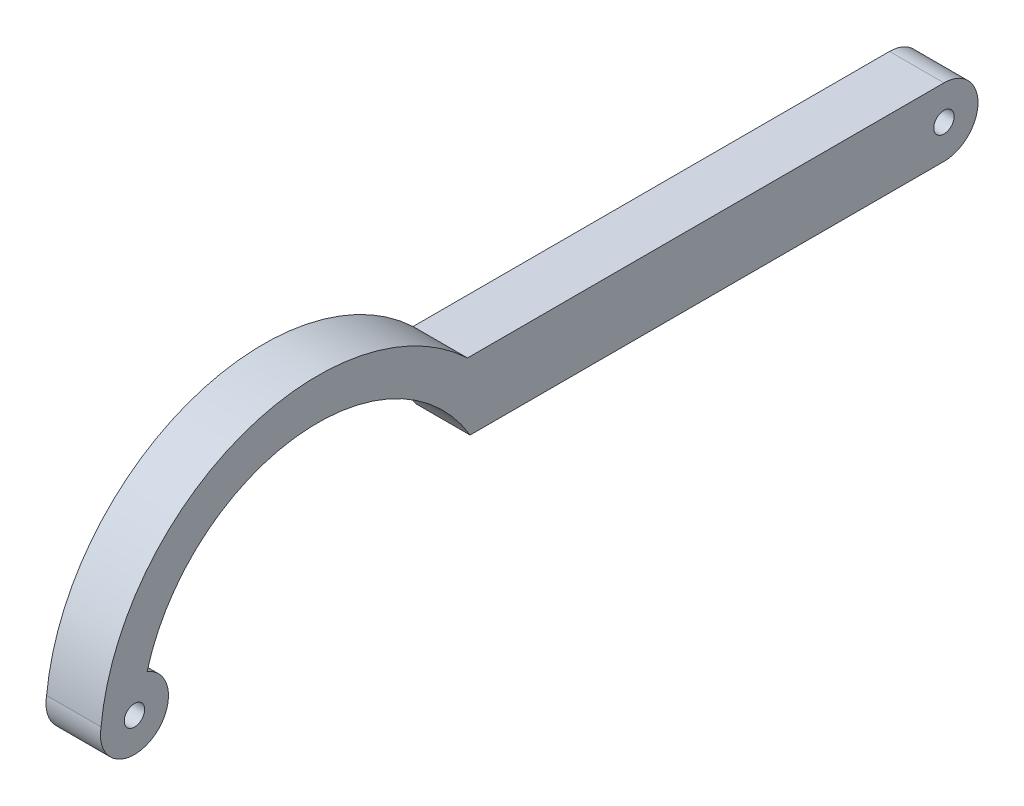
ISO-10303-21;
HEADER;
FILE_DESCRIPTION(('STEP AP214'),'2;1');
FILE_NAME('part.step','',(''),(''),'','','');
FILE_SCHEMA(('AUTOMOTIVE_DESIGN { 1 0 10303 214 1 1 1 1 }'));
ENDSEC;
DATA;
#1=APPLICATION_CONTEXT('core data for automotive mechanical design processes');
#2=APPLICATION_PROTOCOL_DEFINITION('international standard','automotive_design',2000,#1);
#3=PRODUCT_CONTEXT('',#1,'mechanical');
#4=PRODUCT('Part','Part','',(#3));
#5=PRODUCT_RELATED_PRODUCT_CATEGORY('part','',(#4));
#6=PRODUCT_DEFINITION_FORMATION('','',#4);
#7=PRODUCT_DEFINITION_CONTEXT('part definition',#1,'design');
#8=PRODUCT_DEFINITION('design','',#6,#7);
#9=PRODUCT_DEFINITION_SHAPE('','',#8);
#10=(LENGTH_UNIT() NAMED_UNIT(*) SI_UNIT(.MILLI.,.METRE.));
#11=(NAMED_UNIT(*) PLANE_ANGLE_UNIT() SI_UNIT($,.RADIAN.));
#12=(NAMED_UNIT(*) SI_UNIT($,.STERADIAN.) SOLID_ANGLE_UNIT());
#13=UNCERTAINTY_MEASURE_WITH_UNIT(LENGTH_MEASURE(1.E-05),#10,'distance_accuracy_value','');
#14=(GEOMETRIC_REPRESENTATION_CONTEXT(3) GLOBAL_UNCERTAINTY_ASSIGNED_CONTEXT((#13)) GLOBAL_UNIT_ASSIGNED_CONTEXT((#10,
#11,#12)) REPRESENTATION_CONTEXT('',''));
#15=CARTESIAN_POINT('',(0.,0.,0.));
#16=DIRECTION('',(0.,0.,1.));
#17=DIRECTION('',(1.,0.,0.));
#18=AXIS2_PLACEMENT_3D('',#15,#16,#17);
#19=CARTESIAN_POINT('',(4.,-1.12098448473489,-13.4664243080931));
#20=DIRECTION('',(1.,0.,0.));
#21=DIRECTION('',(0.,0.,-1.));
#22=AXIS2_PLACEMENT_3D('',#19,#20,#21);
#23=PLANE('',#22);
#24=CARTESIAN_POINT('',(4.,8.,-59.464274989274));
#25=DIRECTION('',(1.,0.,0.));
#26=DIRECTION('',(0.,0.,-1.));
#27=AXIS2_PLACEMENT_3D('',#24,#25,#26);
#28=CIRCLE('',#27,0.749999999999999);
#29=CARTESIAN_POINT('',(4.,8.,-60.214274989274));
#30=VERTEX_POINT('',#29);
#31=EDGE_CURVE('E144',#30,#30,#28,.T.);
#32=ORIENTED_EDGE('',*,*,#31,.F.);
#33=EDGE_LOOP('',(#32));
#34=FACE_BOUND('',#33,.T.);
#35=CARTESIAN_POINT('',(4.,-1.12098448473489,-13.4664243080931));
#36=DIRECTION('',(1.,0.,0.));
#37=DIRECTION('',(0.,0.,-1.));
#38=AXIS2_PLACEMENT_3D('',#35,#36,#37);
#39=CIRCLE('',#38,16.);
#40=CARTESIAN_POINT('',(4.,10.5,-24.464274989274));
#41=VERTEX_POINT('',#40);
#42=CARTESIAN_POINT('',(4.,0.482216385258856,2.45305266103031));
#43=VERTEX_POINT('',#42);
#44=EDGE_CURVE('E156',#41,#43,#39,.T.);
#45=ORIENTED_EDGE('',*,*,#44,.T.);
#46=CARTESIAN_POINT('',(4.,0.,0.));
#47=DIRECTION('',(1.,0.,0.));
#48=DIRECTION('',(0.,0.,-1.));
#49=AXIS2_PLACEMENT_3D('',#46,#47,#48);
#50=CIRCLE('',#49,2.5);
#51=CARTESIAN_POINT('',(4.,2.32049090490723,-0.930226832682662));
#52=VERTEX_POINT('',#51);
#53=EDGE_CURVE('E104',#43,#52,#50,.T.);
#54=ORIENTED_EDGE('',*,*,#53,.T.);
#55=CARTESIAN_POINT('',(4.,-1.12098448473489,-13.4664243080931));
#56=DIRECTION('',(-1.,0.,0.));
#57=DIRECTION('',(0.,0.,1.));
#58=AXIS2_PLACEMENT_3D('',#55,#56,#57);
#59=CIRCLE('',#58,13.);
#60=CARTESIAN_POINT('',(4.,5.49999999999999,-24.6540319367553));
#61=VERTEX_POINT('',#60);
#62=EDGE_CURVE('E117',#52,#61,#59,.T.);
#63=ORIENTED_EDGE('',*,*,#62,.T.);
#64=DIRECTION('',(0.,0.,-1.));
#65=VECTOR('',#64,1.);
#66=CARTESIAN_POINT('',(4.,5.5,-59.464274989274));
#67=LINE('',#66,#65);
#68=CARTESIAN_POINT('',(4.,5.5,-59.464274989274));
#69=VERTEX_POINT('',#68);
#70=EDGE_CURVE('E111',#61,#69,#67,.T.);
#71=ORIENTED_EDGE('',*,*,#70,.T.);
#72=CARTESIAN_POINT('',(4.,8.,-59.464274989274));
#73=DIRECTION('',(1.,0.,0.));
#74=DIRECTION('',(0.,0.,-1.));
#75=AXIS2_PLACEMENT_3D('',#72,#73,#74);
#76=CIRCLE('',#75,2.5);
#77=CARTESIAN_POINT('',(4.,10.5,-59.464274989274));
#78=VERTEX_POINT('',#77);
#79=EDGE_CURVE('E115',#69,#78,#76,.T.);
#80=ORIENTED_EDGE('',*,*,#79,.T.);
#81=DIRECTION('',(0.,0.,1.));
#82=VECTOR('',#81,1.);
#83=CARTESIAN_POINT('',(4.,10.5,-59.464274989274));
#84=LINE('',#83,#82);
#85=EDGE_CURVE('E67',#78,#41,#84,.T.);
#86=ORIENTED_EDGE('',*,*,#85,.T.);
#87=EDGE_LOOP('',(#45,#54,#63,#71,#80,#86));
#88=FACE_BOUND('',#87,.T.);
#89=CARTESIAN_POINT('',(4.,0.,0.));
#90=DIRECTION('',(1.,0.,0.));
#91=DIRECTION('',(0.,0.,-1.));
#92=AXIS2_PLACEMENT_3D('',#89,#90,#91);
#93=CIRCLE('',#92,0.75);
#94=CARTESIAN_POINT('',(4.,0.,-0.75));
#95=VERTEX_POINT('',#94);
#96=EDGE_CURVE('E202',#95,#95,#93,.T.);
#97=ORIENTED_EDGE('',*,*,#96,.F.);
#98=EDGE_LOOP('',(#97));
#99=FACE_BOUND('',#98,.T.);
#100=ADVANCED_FACE('F49',(#34,#88,#99),#23,.T.);
#101=CARTESIAN_POINT('',(0.,-1.12098448473489,-13.4664243080931));
#102=DIRECTION('',(1.,0.,0.));
#103=DIRECTION('',(0.,0.,-1.));
#104=AXIS2_PLACEMENT_3D('',#101,#102,#103);
#105=PLANE('',#104);
#106=CARTESIAN_POINT('',(0.,-1.12098448473489,-13.4664243080931));
#107=DIRECTION('',(1.,0.,0.));
#108=DIRECTION('',(0.,0.,-1.));
#109=AXIS2_PLACEMENT_3D('',#106,#107,#108);
#110=CIRCLE('',#109,16.);
#111=CARTESIAN_POINT('',(0.,10.5,-24.464274989274));
#112=VERTEX_POINT('',#111);
#113=CARTESIAN_POINT('',(0.,0.482216385258856,2.45305266103031));
#114=VERTEX_POINT('',#113);
#115=EDGE_CURVE('E139',#112,#114,#110,.T.);
#116=ORIENTED_EDGE('',*,*,#115,.F.);
#117=DIRECTION('',(0.,0.,1.));
#118=VECTOR('',#117,1.);
#119=CARTESIAN_POINT('',(0.,10.5,-59.464274989274));
#120=LINE('',#119,#118);
#121=CARTESIAN_POINT('',(0.,10.5,-59.464274989274));
#122=VERTEX_POINT('',#121);
#123=EDGE_CURVE('E96',#122,#112,#120,.T.);
#124=ORIENTED_EDGE('',*,*,#123,.F.);
#125=CARTESIAN_POINT('',(0.,8.,-59.464274989274));
#126=DIRECTION('',(1.,0.,0.));
#127=DIRECTION('',(0.,0.,-1.));
#128=AXIS2_PLACEMENT_3D('',#125,#126,#127);
#129=CIRCLE('',#128,2.5);
#130=CARTESIAN_POINT('',(0.,5.5,-59.464274989274));
#131=VERTEX_POINT('',#130);
#132=EDGE_CURVE('E90',#131,#122,#129,.T.);
#133=ORIENTED_EDGE('',*,*,#132,.F.);
#134=DIRECTION('',(0.,0.,-1.));
#135=VECTOR('',#134,1.);
#136=CARTESIAN_POINT('',(0.,5.5,-59.464274989274));
#137=LINE('',#136,#135);
#138=CARTESIAN_POINT('',(0.,5.49999999999999,-24.6540319367553));
#139=VERTEX_POINT('',#138);
#140=EDGE_CURVE('E126',#139,#131,#137,.T.);
#141=ORIENTED_EDGE('',*,*,#140,.F.);
#142=CARTESIAN_POINT('',(0.,-1.12098448473489,-13.4664243080931));
#143=DIRECTION('',(-1.,0.,0.));
#144=DIRECTION('',(0.,0.,1.));
#145=AXIS2_PLACEMENT_3D('',#142,#143,#144);
#146=CIRCLE('',#145,13.);
#147=CARTESIAN_POINT('',(0.,2.32049090490723,-0.930226832682662));
#148=VERTEX_POINT('',#147);
#149=EDGE_CURVE('E147',#148,#139,#146,.T.);
#150=ORIENTED_EDGE('',*,*,#149,.F.);
#151=CARTESIAN_POINT('',(0.,0.,0.));
#152=DIRECTION('',(1.,0.,0.));
#153=DIRECTION('',(0.,0.,-1.));
#154=AXIS2_PLACEMENT_3D('',#151,#152,#153);
#155=CIRCLE('',#154,2.5);
#156=EDGE_CURVE('E143',#114,#148,#155,.T.);
#157=ORIENTED_EDGE('',*,*,#156,.F.);
#158=EDGE_LOOP('',(#116,#124,#133,#141,#150,#157));
#159=FACE_BOUND('',#158,.T.);
#160=CARTESIAN_POINT('',(0.,8.,-59.464274989274));
#161=DIRECTION('',(1.,0.,0.));
#162=DIRECTION('',(0.,0.,-1.));
#163=AXIS2_PLACEMENT_3D('',#160,#161,#162);
#164=CIRCLE('',#163,0.749999999999999);
#165=CARTESIAN_POINT('',(0.,8.,-60.214274989274));
#166=VERTEX_POINT('',#165);
#167=EDGE_CURVE('E210',#166,#166,#164,.T.);
#168=ORIENTED_EDGE('',*,*,#167,.T.);
#169=EDGE_LOOP('',(#168));
#170=FACE_BOUND('',#169,.T.);
#171=CARTESIAN_POINT('',(0.,0.,0.));
#172=DIRECTION('',(1.,0.,0.));
#173=DIRECTION('',(0.,0.,-1.));
#174=AXIS2_PLACEMENT_3D('',#171,#172,#173);
#175=CIRCLE('',#174,0.75);
#176=CARTESIAN_POINT('',(0.,0.,-0.75));
#177=VERTEX_POINT('',#176);
#178=EDGE_CURVE('E205',#177,#177,#175,.T.);
#179=ORIENTED_EDGE('',*,*,#178,.T.);
#180=EDGE_LOOP('',(#179));
#181=FACE_BOUND('',#180,.T.);
#182=ADVANCED_FACE('F169',(#159,#170,#181),#105,.F.);
#183=CARTESIAN_POINT('',(4.,-1.12098448473489,-13.4664243080931));
#184=DIRECTION('',(-1.,0.,0.));
#185=DIRECTION('',(0.,0.,1.));
#186=AXIS2_PLACEMENT_3D('',#183,#184,#185);
#187=CYLINDRICAL_SURFACE('',#186,16.);
#188=ORIENTED_EDGE('',*,*,#115,.T.);
#189=DIRECTION('',(-1.,0.,0.));
#190=VECTOR('',#189,1.);
#191=CARTESIAN_POINT('',(4.,0.482216385258856,2.45305266103031));
#192=LINE('',#191,#190);
#193=EDGE_CURVE('E11',#43,#114,#192,.T.);
#194=ORIENTED_EDGE('',*,*,#193,.F.);
#195=ORIENTED_EDGE('',*,*,#44,.F.);
#196=DIRECTION('',(-1.,0.,0.));
#197=VECTOR('',#196,1.);
#198=CARTESIAN_POINT('',(4.,10.5,-24.464274989274));
#199=LINE('',#198,#197);
#200=EDGE_CURVE('E135',#41,#112,#199,.T.);
#201=ORIENTED_EDGE('',*,*,#200,.T.);
#202=EDGE_LOOP('',(#188,#194,#195,#201));
#203=FACE_BOUND('',#202,.T.);
#204=ADVANCED_FACE('F51',(#203),#187,.T.);
#205=CARTESIAN_POINT('',(4.,0.,0.));
#206=DIRECTION('',(-1.,0.,0.));
#207=DIRECTION('',(0.,0.,1.));
#208=AXIS2_PLACEMENT_3D('',#205,#206,#207);
#209=CYLINDRICAL_SURFACE('',#208,2.5);
#210=ORIENTED_EDGE('',*,*,#156,.T.);
#211=DIRECTION('',(-1.,0.,0.));
#212=VECTOR('',#211,1.);
#213=CARTESIAN_POINT('',(4.,2.32049090490723,-0.930226832682662));
#214=LINE('',#213,#212);
#215=EDGE_CURVE('E59',#52,#148,#214,.T.);
#216=ORIENTED_EDGE('',*,*,#215,.F.);
#217=ORIENTED_EDGE('',*,*,#53,.F.);
#218=ORIENTED_EDGE('',*,*,#193,.T.);
#219=EDGE_LOOP('',(#210,#216,#217,#218));
#220=FACE_BOUND('',#219,.T.);
#221=ADVANCED_FACE('F256',(#220),#209,.T.);
#222=CARTESIAN_POINT('',(4.,-1.12098448473489,-13.4664243080931));
#223=DIRECTION('',(-1.,0.,0.));
#224=DIRECTION('',(0.,0.,1.));
#225=AXIS2_PLACEMENT_3D('',#222,#223,#224);
#226=CYLINDRICAL_SURFACE('',#225,13.);
#227=ORIENTED_EDGE('',*,*,#149,.T.);
#228=DIRECTION('',(-1.,0.,0.));
#229=VECTOR('',#228,1.);
#230=CARTESIAN_POINT('',(4.,5.49999999999999,-24.6540319367553));
#231=LINE('',#230,#229);
#232=EDGE_CURVE('E128',#61,#139,#231,.T.);
#233=ORIENTED_EDGE('',*,*,#232,.F.);
#234=ORIENTED_EDGE('',*,*,#62,.F.);
#235=ORIENTED_EDGE('',*,*,#215,.T.);
#236=EDGE_LOOP('',(#227,#233,#234,#235));
#237=FACE_BOUND('',#236,.T.);
#238=ADVANCED_FACE('F166',(#237),#226,.F.);
#239=CARTESIAN_POINT('',(4.,5.5,-59.464274989274));
#240=DIRECTION('',(0.,1.,0.));
#241=DIRECTION('',(0.,0.,1.));
#242=AXIS2_PLACEMENT_3D('',#239,#240,#241);
#243=PLANE('',#242);
#244=ORIENTED_EDGE('',*,*,#140,.T.);
#245=DIRECTION('',(-1.,0.,0.));
#246=VECTOR('',#245,1.);
#247=CARTESIAN_POINT('',(4.,5.5,-59.464274989274));
#248=LINE('',#247,#246);
#249=EDGE_CURVE('E123',#69,#131,#248,.T.);
#250=ORIENTED_EDGE('',*,*,#249,.F.);
#251=ORIENTED_EDGE('',*,*,#70,.F.);
#252=ORIENTED_EDGE('',*,*,#232,.T.);
#253=EDGE_LOOP('',(#244,#250,#251,#252));
#254=FACE_BOUND('',#253,.T.);
#255=ADVANCED_FACE('F124',(#254),#243,.F.);
#256=CARTESIAN_POINT('',(4.,8.,-59.464274989274));
#257=DIRECTION('',(-1.,0.,0.));
#258=DIRECTION('',(0.,0.,1.));
#259=AXIS2_PLACEMENT_3D('',#256,#257,#258);
#260=CYLINDRICAL_SURFACE('',#259,2.5);
#261=ORIENTED_EDGE('',*,*,#132,.T.);
#262=DIRECTION('',(-1.,0.,0.));
#263=VECTOR('',#262,1.);
#264=CARTESIAN_POINT('',(4.,10.5,-59.464274989274));
#265=LINE('',#264,#263);
#266=EDGE_CURVE('E129',#78,#122,#265,.T.);
#267=ORIENTED_EDGE('',*,*,#266,.F.);
#268=ORIENTED_EDGE('',*,*,#79,.F.);
#269=ORIENTED_EDGE('',*,*,#249,.T.);
#270=EDGE_LOOP('',(#261,#267,#268,#269));
#271=FACE_BOUND('',#270,.T.);
#272=ADVANCED_FACE('F131',(#271),#260,.T.);
#273=CARTESIAN_POINT('',(4.,10.5,-59.464274989274));
#274=DIRECTION('',(0.,-1.,0.));
#275=DIRECTION('',(0.,0.,-1.));
#276=AXIS2_PLACEMENT_3D('',#273,#274,#275);
#277=PLANE('',#276);
#278=ORIENTED_EDGE('',*,*,#123,.T.);
#279=ORIENTED_EDGE('',*,*,#200,.F.);
#280=ORIENTED_EDGE('',*,*,#85,.F.);
#281=ORIENTED_EDGE('',*,*,#266,.T.);
#282=EDGE_LOOP('',(#278,#279,#280,#281));
#283=FACE_BOUND('',#282,.T.);
#284=ADVANCED_FACE('F174',(#283),#277,.F.);
#285=CARTESIAN_POINT('',(4.,8.,-59.464274989274));
#286=DIRECTION('',(-1.,0.,0.));
#287=DIRECTION('',(0.,0.,1.));
#288=AXIS2_PLACEMENT_3D('',#285,#286,#287);
#289=CYLINDRICAL_SURFACE('',#288,0.749999999999999);
#290=ORIENTED_EDGE('',*,*,#31,.T.);
#291=EDGE_LOOP('',(#290));
#292=FACE_BOUND('',#291,.T.);
#293=ORIENTED_EDGE('',*,*,#167,.F.);
#294=EDGE_LOOP('',(#293));
#295=FACE_BOUND('',#294,.T.);
#296=ADVANCED_FACE('F176',(#292,#295),#289,.F.);
#297=CARTESIAN_POINT('',(4.,0.,0.));
#298=DIRECTION('',(-1.,0.,0.));
#299=DIRECTION('',(0.,0.,1.));
#300=AXIS2_PLACEMENT_3D('',#297,#298,#299);
#301=CYLINDRICAL_SURFACE('',#300,0.75);
#302=ORIENTED_EDGE('',*,*,#96,.T.);
#303=EDGE_LOOP('',(#302));
#304=FACE_BOUND('',#303,.T.);
#305=ORIENTED_EDGE('',*,*,#178,.F.);
#306=EDGE_LOOP('',(#305));
#307=FACE_BOUND('',#306,.T.);
#308=ADVANCED_FACE('F182',(#304,#307),#301,.F.);
#309=CLOSED_SHELL('',(#100,#182,#204,#221,#238,#255,#272,#284,#296,#308));
#310=MANIFOLD_SOLID_BREP('B2',#309);
#311=ADVANCED_BREP_SHAPE_REPRESENTATION('',(#18,#310),#14);
#312=SHAPE_DEFINITION_REPRESENTATION(#9,#311);
ENDSEC;
END-ISO-10303-21;
